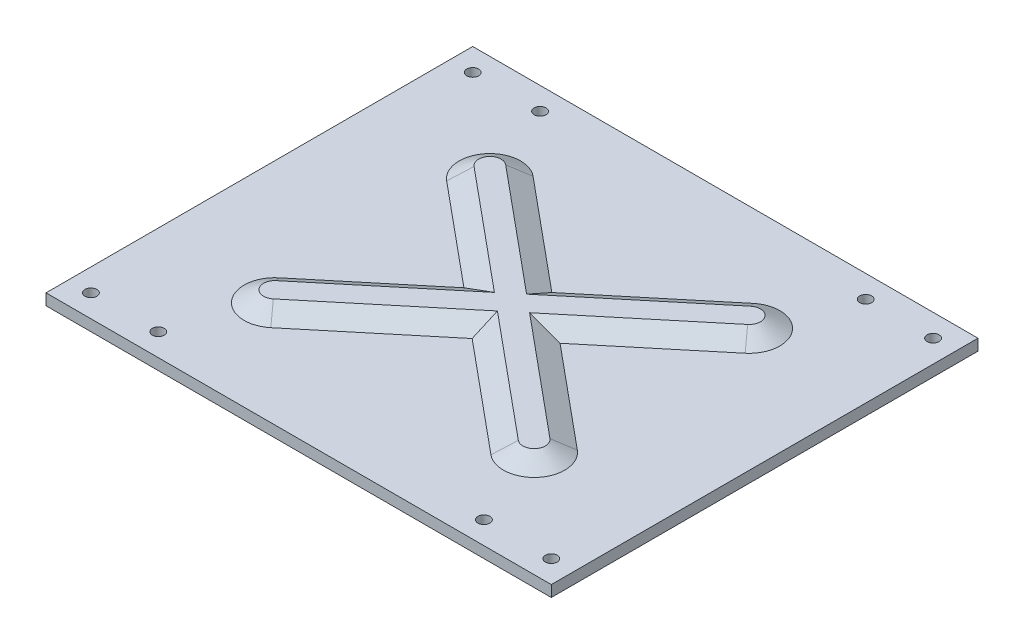
ISO-10303-21;
HEADER;
FILE_DESCRIPTION(('STEP AP214'),'2;1');
FILE_NAME('part.step','',(''),(''),'','','');
FILE_SCHEMA(('AUTOMOTIVE_DESIGN { 1 0 10303 214 1 1 1 1 }'));
ENDSEC;
DATA;
#1=APPLICATION_CONTEXT('core data for automotive mechanical design processes');
#2=APPLICATION_PROTOCOL_DEFINITION('international standard','automotive_design',2000,#1);
#3=PRODUCT_CONTEXT('',#1,'mechanical');
#4=PRODUCT('Part','Part','',(#3));
#5=PRODUCT_RELATED_PRODUCT_CATEGORY('part','',(#4));
#6=PRODUCT_DEFINITION_FORMATION('','',#4);
#7=PRODUCT_DEFINITION_CONTEXT('part definition',#1,'design');
#8=PRODUCT_DEFINITION('design','',#6,#7);
#9=PRODUCT_DEFINITION_SHAPE('','',#8);
#10=(LENGTH_UNIT() NAMED_UNIT(*) SI_UNIT(.MILLI.,.METRE.));
#11=(NAMED_UNIT(*) PLANE_ANGLE_UNIT() SI_UNIT($,.RADIAN.));
#12=(NAMED_UNIT(*) SI_UNIT($,.STERADIAN.) SOLID_ANGLE_UNIT());
#13=UNCERTAINTY_MEASURE_WITH_UNIT(LENGTH_MEASURE(1.E-05),#10,'distance_accuracy_value','');
#14=(GEOMETRIC_REPRESENTATION_CONTEXT(3) GLOBAL_UNCERTAINTY_ASSIGNED_CONTEXT((#13)) GLOBAL_UNIT_ASSIGNED_CONTEXT((#10,
#11,#12)) REPRESENTATION_CONTEXT('',''));
#15=CARTESIAN_POINT('',(0.,0.,0.));
#16=DIRECTION('',(0.,0.,1.));
#17=DIRECTION('',(1.,0.,0.));
#18=AXIS2_PLACEMENT_3D('',#15,#16,#17);
#19=CARTESIAN_POINT('',(0.,5.,0.));
#20=DIRECTION('',(0.,-1.,0.));
#21=DIRECTION('',(0.,0.,-1.));
#22=AXIS2_PLACEMENT_3D('',#19,#20,#21);
#23=PLANE('',#22);
#24=CARTESIAN_POINT('',(170.231847029505,5.,-47.1248097804108));
#25=DIRECTION('',(0.,-1.,0.));
#26=DIRECTION('',(0.,0.,-1.));
#27=AXIS2_PLACEMENT_3D('',#24,#25,#26);
#28=CIRCLE('',#27,13.6602540378445);
#29=CARTESIAN_POINT('',(178.951677169634,5.,-57.6398990670375));
#30=VERTEX_POINT('',#29);
#31=CARTESIAN_POINT('',(161.512016889375,5.,-36.6097204937839));
#32=VERTEX_POINT('',#31);
#33=EDGE_CURVE('E42',#30,#32,#28,.T.);
#34=ORIENTED_EDGE('',*,*,#33,.T.);
#35=DIRECTION('',(-0.769757960393397,0.,-0.638335869594524));
#36=VECTOR('',#35,1.);
#37=CARTESIAN_POINT('',(106.971849207843,5.,-81.8381522296885));
#38=LINE('',#37,#36);
#39=CARTESIAN_POINT('',(112.5,5.,-77.2538320605828));
#40=VERTEX_POINT('',#39);
#41=EDGE_CURVE('E11',#32,#40,#38,.T.);
#42=ORIENTED_EDGE('',*,*,#41,.T.);
#43=DIRECTION('',(-0.769757960393397,0.,0.638335869594524));
#44=VECTOR('',#43,1.);
#45=CARTESIAN_POINT('',(7.88091579398925,5.,9.50345728098704));
#46=LINE('',#45,#44);
#47=CARTESIAN_POINT('',(63.4879831106248,5.,-36.6097204937838));
#48=VERTEX_POINT('',#47);
#49=EDGE_CURVE('E275',#40,#48,#46,.T.);
#50=ORIENTED_EDGE('',*,*,#49,.T.);
#51=CARTESIAN_POINT('',(54.7681529704953,5.,-47.1248097804107));
#52=DIRECTION('',(0.,-1.,0.));
#53=DIRECTION('',(0.,0.,-1.));
#54=AXIS2_PLACEMENT_3D('',#51,#52,#53);
#55=CIRCLE('',#54,13.6602540378445);
#56=CARTESIAN_POINT('',(46.0483228303657,5.,-57.6398990670375));
#57=VERTEX_POINT('',#56);
#58=EDGE_CURVE('E162',#48,#57,#55,.T.);
#59=ORIENTED_EDGE('',*,*,#58,.T.);
#60=DIRECTION('',(0.769757960393397,0.,-0.638335869594524));
#61=VECTOR('',#60,1.);
#62=CARTESIAN_POINT('',(-9.55874448626985,5.,-11.5267212922666));
#63=LINE('',#62,#61);
#64=CARTESIAN_POINT('',(91.1002092495263,5.,-95.));
#65=VERTEX_POINT('',#64);
#66=EDGE_CURVE('E268',#57,#65,#63,.T.);
#67=ORIENTED_EDGE('',*,*,#66,.T.);
#68=DIRECTION('',(-0.769757960393397,0.,-0.638335869594524));
#69=VECTOR('',#68,1.);
#70=CARTESIAN_POINT('',(46.0483228303657,5.,-132.360100932962));
#71=LINE('',#70,#69);
#72=CARTESIAN_POINT('',(46.0483228303657,5.,-132.360100932962));
#73=VERTEX_POINT('',#72);
#74=EDGE_CURVE('E270',#65,#73,#71,.T.);
#75=ORIENTED_EDGE('',*,*,#74,.T.);
#76=CARTESIAN_POINT('',(54.7681529704953,5.,-142.875190219589));
#77=DIRECTION('',(0.,-1.,0.));
#78=DIRECTION('',(0.,0.,-1.));
#79=AXIS2_PLACEMENT_3D('',#76,#77,#78);
#80=CIRCLE('',#79,13.6602540378445);
#81=CARTESIAN_POINT('',(63.4879831106248,5.,-153.390279506216));
#82=VERTEX_POINT('',#81);
#83=EDGE_CURVE('E273',#73,#82,#80,.T.);
#84=ORIENTED_EDGE('',*,*,#83,.T.);
#85=DIRECTION('',(0.769757960393397,0.,0.638335869594524));
#86=VECTOR('',#85,1.);
#87=CARTESIAN_POINT('',(118.028150792157,5.,-108.161847770311));
#88=LINE('',#87,#86);
#89=CARTESIAN_POINT('',(112.5,5.,-112.746167939417));
#90=VERTEX_POINT('',#89);
#91=EDGE_CURVE('E277',#82,#90,#88,.T.);
#92=ORIENTED_EDGE('',*,*,#91,.T.);
#93=DIRECTION('',(0.769757960393397,0.,-0.638335869594524));
#94=VECTOR('',#93,1.);
#95=CARTESIAN_POINT('',(-9.55874448626981,5.,-11.5267212922665));
#96=LINE('',#95,#94);
#97=CARTESIAN_POINT('',(161.512016889375,5.,-153.390279506216));
#98=VERTEX_POINT('',#97);
#99=EDGE_CURVE('E279',#90,#98,#96,.T.);
#100=ORIENTED_EDGE('',*,*,#99,.T.);
#101=CARTESIAN_POINT('',(170.231847029505,5.,-142.875190219589));
#102=DIRECTION('',(0.,-1.,0.));
#103=DIRECTION('',(0.,0.,-1.));
#104=AXIS2_PLACEMENT_3D('',#101,#102,#103);
#105=CIRCLE('',#104,13.6602540378444);
#106=CARTESIAN_POINT('',(178.951677169634,5.,-132.360100932962));
#107=VERTEX_POINT('',#106);
#108=EDGE_CURVE('E281',#98,#107,#105,.T.);
#109=ORIENTED_EDGE('',*,*,#108,.T.);
#110=DIRECTION('',(-0.769757960393397,0.,0.638335869594524));
#111=VECTOR('',#110,1.);
#112=CARTESIAN_POINT('',(7.88091579398922,5.,9.503457280987));
#113=LINE('',#112,#111);
#114=CARTESIAN_POINT('',(133.899790750474,5.,-95.));
#115=VERTEX_POINT('',#114);
#116=EDGE_CURVE('E283',#107,#115,#113,.T.);
#117=ORIENTED_EDGE('',*,*,#116,.T.);
#118=DIRECTION('',(0.769757960393397,0.,0.638335869594524));
#119=VECTOR('',#118,1.);
#120=CARTESIAN_POINT('',(178.951677169634,5.,-57.6398990670376));
#121=LINE('',#120,#119);
#122=EDGE_CURVE('E53',#115,#30,#121,.T.);
#123=ORIENTED_EDGE('',*,*,#122,.T.);
#124=EDGE_LOOP('',(#34,#42,#50,#59,#67,#75,#84,#92,#100,#109,#117,#123));
#125=FACE_BOUND('',#124,.T.);
#126=CARTESIAN_POINT('',(10.,5.,-10.));
#127=DIRECTION('',(0.,1.,0.));
#128=DIRECTION('',(0.,0.,-1.));
#129=AXIS2_PLACEMENT_3D('',#126,#127,#128);
#130=CIRCLE('',#129,2.65);
#131=CARTESIAN_POINT('',(10.,5.,-12.65));
#132=VERTEX_POINT('',#131);
#133=EDGE_CURVE('E191',#132,#132,#130,.T.);
#134=ORIENTED_EDGE('',*,*,#133,.F.);
#135=EDGE_LOOP('',(#134));
#136=FACE_BOUND('',#135,.T.);
#137=CARTESIAN_POINT('',(40.,5.,-10.));
#138=DIRECTION('',(0.,1.,0.));
#139=DIRECTION('',(0.,0.,-1.));
#140=AXIS2_PLACEMENT_3D('',#137,#138,#139);
#141=CIRCLE('',#140,2.65);
#142=CARTESIAN_POINT('',(40.,5.,-12.65));
#143=VERTEX_POINT('',#142);
#144=EDGE_CURVE('E197',#143,#143,#141,.T.);
#145=ORIENTED_EDGE('',*,*,#144,.F.);
#146=EDGE_LOOP('',(#145));
#147=FACE_BOUND('',#146,.T.);
#148=CARTESIAN_POINT('',(185.,5.,-10.));
#149=DIRECTION('',(0.,1.,0.));
#150=DIRECTION('',(0.,0.,-1.));
#151=AXIS2_PLACEMENT_3D('',#148,#149,#150);
#152=CIRCLE('',#151,2.65000000000001);
#153=CARTESIAN_POINT('',(185.,5.,-12.65));
#154=VERTEX_POINT('',#153);
#155=EDGE_CURVE('E203',#154,#154,#152,.T.);
#156=ORIENTED_EDGE('',*,*,#155,.F.);
#157=EDGE_LOOP('',(#156));
#158=FACE_BOUND('',#157,.T.);
#159=CARTESIAN_POINT('',(215.,5.,-10.));
#160=DIRECTION('',(0.,1.,0.));
#161=DIRECTION('',(0.,0.,-1.));
#162=AXIS2_PLACEMENT_3D('',#159,#160,#161);
#163=CIRCLE('',#162,2.65000000000001);
#164=CARTESIAN_POINT('',(215.,5.,-12.65));
#165=VERTEX_POINT('',#164);
#166=EDGE_CURVE('E209',#165,#165,#163,.T.);
#167=ORIENTED_EDGE('',*,*,#166,.F.);
#168=EDGE_LOOP('',(#167));
#169=FACE_BOUND('',#168,.T.);
#170=CARTESIAN_POINT('',(215.,5.,-180.));
#171=DIRECTION('',(0.,1.,0.));
#172=DIRECTION('',(0.,0.,1.));
#173=AXIS2_PLACEMENT_3D('',#170,#171,#172);
#174=CIRCLE('',#173,2.65000000000002);
#175=CARTESIAN_POINT('',(215.,5.,-177.35));
#176=VERTEX_POINT('',#175);
#177=EDGE_CURVE('E215',#176,#176,#174,.T.);
#178=ORIENTED_EDGE('',*,*,#177,.F.);
#179=EDGE_LOOP('',(#178));
#180=FACE_BOUND('',#179,.T.);
#181=CARTESIAN_POINT('',(185.,5.,-180.));
#182=DIRECTION('',(0.,1.,0.));
#183=DIRECTION('',(0.,0.,1.));
#184=AXIS2_PLACEMENT_3D('',#181,#182,#183);
#185=CIRCLE('',#184,2.65000000000002);
#186=CARTESIAN_POINT('',(185.,5.,-177.35));
#187=VERTEX_POINT('',#186);
#188=EDGE_CURVE('E221',#187,#187,#185,.T.);
#189=ORIENTED_EDGE('',*,*,#188,.F.);
#190=EDGE_LOOP('',(#189));
#191=FACE_BOUND('',#190,.T.);
#192=CARTESIAN_POINT('',(40.,5.,-180.));
#193=DIRECTION('',(0.,1.,0.));
#194=DIRECTION('',(0.,0.,1.));
#195=AXIS2_PLACEMENT_3D('',#192,#193,#194);
#196=CIRCLE('',#195,2.65);
#197=CARTESIAN_POINT('',(40.,5.,-177.35));
#198=VERTEX_POINT('',#197);
#199=EDGE_CURVE('E227',#198,#198,#196,.T.);
#200=ORIENTED_EDGE('',*,*,#199,.F.);
#201=EDGE_LOOP('',(#200));
#202=FACE_BOUND('',#201,.T.);
#203=CARTESIAN_POINT('',(10.,5.,-180.));
#204=DIRECTION('',(0.,1.,0.));
#205=DIRECTION('',(0.,0.,1.));
#206=AXIS2_PLACEMENT_3D('',#203,#204,#205);
#207=CIRCLE('',#206,2.65);
#208=CARTESIAN_POINT('',(10.,5.,-177.35));
#209=VERTEX_POINT('',#208);
#210=EDGE_CURVE('E233',#209,#209,#207,.T.);
#211=ORIENTED_EDGE('',*,*,#210,.F.);
#212=EDGE_LOOP('',(#211));
#213=FACE_BOUND('',#212,.T.);
#214=DIRECTION('',(0.,0.,1.));
#215=VECTOR('',#214,1.);
#216=CARTESIAN_POINT('',(0.,5.,0.));
#217=LINE('',#216,#215);
#218=CARTESIAN_POINT('',(0.,5.,-190.));
#219=VERTEX_POINT('',#218);
#220=CARTESIAN_POINT('',(0.,5.,0.));
#221=VERTEX_POINT('',#220);
#222=EDGE_CURVE('E239',#219,#221,#217,.T.);
#223=ORIENTED_EDGE('',*,*,#222,.T.);
#224=DIRECTION('',(1.,0.,0.));
#225=VECTOR('',#224,1.);
#226=CARTESIAN_POINT('',(0.,5.,0.));
#227=LINE('',#226,#225);
#228=CARTESIAN_POINT('',(225.,5.,0.));
#229=VERTEX_POINT('',#228);
#230=EDGE_CURVE('E242',#221,#229,#227,.T.);
#231=ORIENTED_EDGE('',*,*,#230,.T.);
#232=DIRECTION('',(0.,0.,-1.));
#233=VECTOR('',#232,1.);
#234=CARTESIAN_POINT('',(225.,5.,0.));
#235=LINE('',#234,#233);
#236=CARTESIAN_POINT('',(225.,5.,-190.));
#237=VERTEX_POINT('',#236);
#238=EDGE_CURVE('E245',#229,#237,#235,.T.);
#239=ORIENTED_EDGE('',*,*,#238,.T.);
#240=DIRECTION('',(-1.,0.,0.));
#241=VECTOR('',#240,1.);
#242=CARTESIAN_POINT('',(0.,5.,-190.));
#243=LINE('',#242,#241);
#244=EDGE_CURVE('E247',#237,#219,#243,.T.);
#245=ORIENTED_EDGE('',*,*,#244,.T.);
#246=EDGE_LOOP('',(#223,#231,#239,#245));
#247=FACE_BOUND('',#246,.T.);
#248=ADVANCED_FACE('F33',(#125,#136,#147,#158,#169,#180,#191,#202,#213,#247),#23,.F.);
#249=CARTESIAN_POINT('',(0.,0.,0.));
#250=DIRECTION('',(0.,-1.,0.));
#251=DIRECTION('',(0.,0.,-1.));
#252=AXIS2_PLACEMENT_3D('',#249,#250,#251);
#253=PLANE('',#252);
#254=CARTESIAN_POINT('',(40.,0.,-10.));
#255=DIRECTION('',(0.,1.,0.));
#256=DIRECTION('',(0.,0.,-1.));
#257=AXIS2_PLACEMENT_3D('',#254,#255,#256);
#258=CIRCLE('',#257,2.65);
#259=CARTESIAN_POINT('',(40.,0.,-12.65));
#260=VERTEX_POINT('',#259);
#261=EDGE_CURVE('E194',#260,#260,#258,.T.);
#262=ORIENTED_EDGE('',*,*,#261,.T.);
#263=EDGE_LOOP('',(#262));
#264=FACE_BOUND('',#263,.T.);
#265=CARTESIAN_POINT('',(215.,0.,-10.));
#266=DIRECTION('',(0.,1.,0.));
#267=DIRECTION('',(0.,0.,-1.));
#268=AXIS2_PLACEMENT_3D('',#265,#266,#267);
#269=CIRCLE('',#268,2.65000000000001);
#270=CARTESIAN_POINT('',(215.,0.,-12.65));
#271=VERTEX_POINT('',#270);
#272=EDGE_CURVE('E206',#271,#271,#269,.T.);
#273=ORIENTED_EDGE('',*,*,#272,.T.);
#274=EDGE_LOOP('',(#273));
#275=FACE_BOUND('',#274,.T.);
#276=CARTESIAN_POINT('',(185.,0.,-180.));
#277=DIRECTION('',(0.,1.,0.));
#278=DIRECTION('',(0.,0.,1.));
#279=AXIS2_PLACEMENT_3D('',#276,#277,#278);
#280=CIRCLE('',#279,2.65000000000002);
#281=CARTESIAN_POINT('',(185.,0.,-177.35));
#282=VERTEX_POINT('',#281);
#283=EDGE_CURVE('E218',#282,#282,#280,.T.);
#284=ORIENTED_EDGE('',*,*,#283,.T.);
#285=EDGE_LOOP('',(#284));
#286=FACE_BOUND('',#285,.T.);
#287=CARTESIAN_POINT('',(10.,0.,-180.));
#288=DIRECTION('',(0.,1.,0.));
#289=DIRECTION('',(0.,0.,1.));
#290=AXIS2_PLACEMENT_3D('',#287,#288,#289);
#291=CIRCLE('',#290,2.65);
#292=CARTESIAN_POINT('',(10.,0.,-177.35));
#293=VERTEX_POINT('',#292);
#294=EDGE_CURVE('E230',#293,#293,#291,.T.);
#295=ORIENTED_EDGE('',*,*,#294,.T.);
#296=EDGE_LOOP('',(#295));
#297=FACE_BOUND('',#296,.T.);
#298=DIRECTION('',(0.,0.,1.));
#299=VECTOR('',#298,1.);
#300=CARTESIAN_POINT('',(0.,0.,0.));
#301=LINE('',#300,#299);
#302=CARTESIAN_POINT('',(0.,0.,-190.));
#303=VERTEX_POINT('',#302);
#304=CARTESIAN_POINT('',(0.,0.,0.));
#305=VERTEX_POINT('',#304);
#306=EDGE_CURVE('E236',#303,#305,#301,.T.);
#307=ORIENTED_EDGE('',*,*,#306,.F.);
#308=DIRECTION('',(-1.,0.,0.));
#309=VECTOR('',#308,1.);
#310=CARTESIAN_POINT('',(0.,0.,-190.));
#311=LINE('',#310,#309);
#312=CARTESIAN_POINT('',(225.,0.,-190.));
#313=VERTEX_POINT('',#312);
#314=EDGE_CURVE('E243',#313,#303,#311,.T.);
#315=ORIENTED_EDGE('',*,*,#314,.F.);
#316=DIRECTION('',(0.,0.,-1.));
#317=VECTOR('',#316,1.);
#318=CARTESIAN_POINT('',(225.,0.,0.));
#319=LINE('',#318,#317);
#320=CARTESIAN_POINT('',(225.,0.,0.));
#321=VERTEX_POINT('',#320);
#322=EDGE_CURVE('E254',#321,#313,#319,.T.);
#323=ORIENTED_EDGE('',*,*,#322,.F.);
#324=DIRECTION('',(1.,0.,0.));
#325=VECTOR('',#324,1.);
#326=CARTESIAN_POINT('',(0.,0.,0.));
#327=LINE('',#326,#325);
#328=EDGE_CURVE('E252',#305,#321,#327,.T.);
#329=ORIENTED_EDGE('',*,*,#328,.F.);
#330=EDGE_LOOP('',(#307,#315,#323,#329));
#331=FACE_BOUND('',#330,.T.);
#332=CARTESIAN_POINT('',(40.,0.,-180.));
#333=DIRECTION('',(0.,1.,0.));
#334=DIRECTION('',(0.,0.,1.));
#335=AXIS2_PLACEMENT_3D('',#332,#333,#334);
#336=CIRCLE('',#335,2.65);
#337=CARTESIAN_POINT('',(40.,0.,-177.35));
#338=VERTEX_POINT('',#337);
#339=EDGE_CURVE('E224',#338,#338,#336,.T.);
#340=ORIENTED_EDGE('',*,*,#339,.T.);
#341=EDGE_LOOP('',(#340));
#342=FACE_BOUND('',#341,.T.);
#343=CARTESIAN_POINT('',(215.,0.,-180.));
#344=DIRECTION('',(0.,1.,0.));
#345=DIRECTION('',(0.,0.,1.));
#346=AXIS2_PLACEMENT_3D('',#343,#344,#345);
#347=CIRCLE('',#346,2.65000000000002);
#348=CARTESIAN_POINT('',(215.,0.,-177.35));
#349=VERTEX_POINT('',#348);
#350=EDGE_CURVE('E212',#349,#349,#347,.T.);
#351=ORIENTED_EDGE('',*,*,#350,.T.);
#352=EDGE_LOOP('',(#351));
#353=FACE_BOUND('',#352,.T.);
#354=CARTESIAN_POINT('',(185.,0.,-10.));
#355=DIRECTION('',(0.,1.,0.));
#356=DIRECTION('',(0.,0.,-1.));
#357=AXIS2_PLACEMENT_3D('',#354,#355,#356);
#358=CIRCLE('',#357,2.65000000000001);
#359=CARTESIAN_POINT('',(185.,0.,-12.65));
#360=VERTEX_POINT('',#359);
#361=EDGE_CURVE('E200',#360,#360,#358,.T.);
#362=ORIENTED_EDGE('',*,*,#361,.T.);
#363=EDGE_LOOP('',(#362));
#364=FACE_BOUND('',#363,.T.);
#365=CARTESIAN_POINT('',(10.,0.,-10.));
#366=DIRECTION('',(0.,1.,0.));
#367=DIRECTION('',(0.,0.,-1.));
#368=AXIS2_PLACEMENT_3D('',#365,#366,#367);
#369=CIRCLE('',#368,2.65);
#370=CARTESIAN_POINT('',(10.,0.,-12.65));
#371=VERTEX_POINT('',#370);
#372=EDGE_CURVE('E190',#371,#371,#369,.T.);
#373=ORIENTED_EDGE('',*,*,#372,.T.);
#374=EDGE_LOOP('',(#373));
#375=FACE_BOUND('',#374,.T.);
#376=ADVANCED_FACE('F346',(#264,#275,#286,#297,#331,#342,#353,#364,#375),#253,.T.);
#377=CARTESIAN_POINT('',(0.,5.,0.));
#378=DIRECTION('',(1.,0.,0.));
#379=DIRECTION('',(0.,0.,-1.));
#380=AXIS2_PLACEMENT_3D('',#377,#378,#379);
#381=PLANE('',#380);
#382=ORIENTED_EDGE('',*,*,#306,.T.);
#383=DIRECTION('',(0.,-1.,0.));
#384=VECTOR('',#383,1.);
#385=CARTESIAN_POINT('',(0.,5.,0.));
#386=LINE('',#385,#384);
#387=EDGE_CURVE('E265',#221,#305,#386,.T.);
#388=ORIENTED_EDGE('',*,*,#387,.F.);
#389=ORIENTED_EDGE('',*,*,#222,.F.);
#390=DIRECTION('',(0.,-1.,0.));
#391=VECTOR('',#390,1.);
#392=CARTESIAN_POINT('',(0.,5.,-190.));
#393=LINE('',#392,#391);
#394=EDGE_CURVE('E249',#219,#303,#393,.T.);
#395=ORIENTED_EDGE('',*,*,#394,.T.);
#396=EDGE_LOOP('',(#382,#388,#389,#395));
#397=FACE_BOUND('',#396,.T.);
#398=ADVANCED_FACE('F351',(#397),#381,.F.);
#399=CARTESIAN_POINT('',(0.,5.,0.));
#400=DIRECTION('',(0.,0.,-1.));
#401=DIRECTION('',(-1.,0.,0.));
#402=AXIS2_PLACEMENT_3D('',#399,#400,#401);
#403=PLANE('',#402);
#404=ORIENTED_EDGE('',*,*,#328,.T.);
#405=DIRECTION('',(0.,-1.,0.));
#406=VECTOR('',#405,1.);
#407=CARTESIAN_POINT('',(225.,5.,0.));
#408=LINE('',#407,#406);
#409=EDGE_CURVE('E262',#229,#321,#408,.T.);
#410=ORIENTED_EDGE('',*,*,#409,.F.);
#411=ORIENTED_EDGE('',*,*,#230,.F.);
#412=ORIENTED_EDGE('',*,*,#387,.T.);
#413=EDGE_LOOP('',(#404,#410,#411,#412));
#414=FACE_BOUND('',#413,.T.);
#415=ADVANCED_FACE('F365',(#414),#403,.F.);
#416=CARTESIAN_POINT('',(225.,5.,0.));
#417=DIRECTION('',(-1.,0.,0.));
#418=DIRECTION('',(0.,0.,1.));
#419=AXIS2_PLACEMENT_3D('',#416,#417,#418);
#420=PLANE('',#419);
#421=ORIENTED_EDGE('',*,*,#322,.T.);
#422=DIRECTION('',(0.,-1.,0.));
#423=VECTOR('',#422,1.);
#424=CARTESIAN_POINT('',(225.,5.,-190.));
#425=LINE('',#424,#423);
#426=EDGE_CURVE('E259',#237,#313,#425,.T.);
#427=ORIENTED_EDGE('',*,*,#426,.F.);
#428=ORIENTED_EDGE('',*,*,#238,.F.);
#429=ORIENTED_EDGE('',*,*,#409,.T.);
#430=EDGE_LOOP('',(#421,#427,#428,#429));
#431=FACE_BOUND('',#430,.T.);
#432=ADVANCED_FACE('F361',(#431),#420,.F.);
#433=CARTESIAN_POINT('',(0.,5.,-190.));
#434=DIRECTION('',(0.,0.,1.));
#435=DIRECTION('',(1.,0.,0.));
#436=AXIS2_PLACEMENT_3D('',#433,#434,#435);
#437=PLANE('',#436);
#438=ORIENTED_EDGE('',*,*,#314,.T.);
#439=ORIENTED_EDGE('',*,*,#394,.F.);
#440=ORIENTED_EDGE('',*,*,#244,.F.);
#441=ORIENTED_EDGE('',*,*,#426,.T.);
#442=EDGE_LOOP('',(#438,#439,#440,#441));
#443=FACE_BOUND('',#442,.T.);
#444=ADVANCED_FACE('F358',(#443),#437,.F.);
#445=CARTESIAN_POINT('',(10.,5.,-180.));
#446=DIRECTION('',(0.,-1.,0.));
#447=DIRECTION('',(0.,0.,-1.));
#448=AXIS2_PLACEMENT_3D('',#445,#446,#447);
#449=CYLINDRICAL_SURFACE('',#448,2.65);
#450=ORIENTED_EDGE('',*,*,#210,.T.);
#451=EDGE_LOOP('',(#450));
#452=FACE_BOUND('',#451,.T.);
#453=ORIENTED_EDGE('',*,*,#294,.F.);
#454=EDGE_LOOP('',(#453));
#455=FACE_BOUND('',#454,.T.);
#456=ADVANCED_FACE('F355',(#452,#455),#449,.F.);
#457=CARTESIAN_POINT('',(40.,5.,-180.));
#458=DIRECTION('',(0.,-1.,0.));
#459=DIRECTION('',(0.,0.,-1.));
#460=AXIS2_PLACEMENT_3D('',#457,#458,#459);
#461=CYLINDRICAL_SURFACE('',#460,2.65);
#462=ORIENTED_EDGE('',*,*,#199,.T.);
#463=EDGE_LOOP('',(#462));
#464=FACE_BOUND('',#463,.T.);
#465=ORIENTED_EDGE('',*,*,#339,.F.);
#466=EDGE_LOOP('',(#465));
#467=FACE_BOUND('',#466,.T.);
#468=ADVANCED_FACE('F531',(#464,#467),#461,.F.);
#469=CARTESIAN_POINT('',(185.,5.,-180.));
#470=DIRECTION('',(0.,-1.,0.));
#471=DIRECTION('',(0.,0.,-1.));
#472=AXIS2_PLACEMENT_3D('',#469,#470,#471);
#473=CYLINDRICAL_SURFACE('',#472,2.65000000000002);
#474=ORIENTED_EDGE('',*,*,#188,.T.);
#475=EDGE_LOOP('',(#474));
#476=FACE_BOUND('',#475,.T.);
#477=ORIENTED_EDGE('',*,*,#283,.F.);
#478=EDGE_LOOP('',(#477));
#479=FACE_BOUND('',#478,.T.);
#480=ADVANCED_FACE('F521',(#476,#479),#473,.F.);
#481=CARTESIAN_POINT('',(215.,5.,-180.));
#482=DIRECTION('',(0.,-1.,0.));
#483=DIRECTION('',(0.,0.,-1.));
#484=AXIS2_PLACEMENT_3D('',#481,#482,#483);
#485=CYLINDRICAL_SURFACE('',#484,2.65000000000002);
#486=ORIENTED_EDGE('',*,*,#177,.T.);
#487=EDGE_LOOP('',(#486));
#488=FACE_BOUND('',#487,.T.);
#489=ORIENTED_EDGE('',*,*,#350,.F.);
#490=EDGE_LOOP('',(#489));
#491=FACE_BOUND('',#490,.T.);
#492=ADVANCED_FACE('F511',(#488,#491),#485,.F.);
#493=CARTESIAN_POINT('',(215.,5.,-10.));
#494=DIRECTION('',(0.,-1.,0.));
#495=DIRECTION('',(0.,0.,-1.));
#496=AXIS2_PLACEMENT_3D('',#493,#494,#495);
#497=CYLINDRICAL_SURFACE('',#496,2.65000000000001);
#498=ORIENTED_EDGE('',*,*,#166,.T.);
#499=EDGE_LOOP('',(#498));
#500=FACE_BOUND('',#499,.T.);
#501=ORIENTED_EDGE('',*,*,#272,.F.);
#502=EDGE_LOOP('',(#501));
#503=FACE_BOUND('',#502,.T.);
#504=ADVANCED_FACE('F501',(#500,#503),#497,.F.);
#505=CARTESIAN_POINT('',(185.,5.,-10.));
#506=DIRECTION('',(0.,-1.,0.));
#507=DIRECTION('',(0.,0.,-1.));
#508=AXIS2_PLACEMENT_3D('',#505,#506,#507);
#509=CYLINDRICAL_SURFACE('',#508,2.65000000000001);
#510=ORIENTED_EDGE('',*,*,#155,.T.);
#511=EDGE_LOOP('',(#510));
#512=FACE_BOUND('',#511,.T.);
#513=ORIENTED_EDGE('',*,*,#361,.F.);
#514=EDGE_LOOP('',(#513));
#515=FACE_BOUND('',#514,.T.);
#516=ADVANCED_FACE('F491',(#512,#515),#509,.F.);
#517=CARTESIAN_POINT('',(40.,5.,-10.));
#518=DIRECTION('',(0.,-1.,0.));
#519=DIRECTION('',(0.,0.,-1.));
#520=AXIS2_PLACEMENT_3D('',#517,#518,#519);
#521=CYLINDRICAL_SURFACE('',#520,2.65);
#522=ORIENTED_EDGE('',*,*,#144,.T.);
#523=EDGE_LOOP('',(#522));
#524=FACE_BOUND('',#523,.T.);
#525=ORIENTED_EDGE('',*,*,#261,.F.);
#526=EDGE_LOOP('',(#525));
#527=FACE_BOUND('',#526,.T.);
#528=ADVANCED_FACE('F481',(#524,#527),#521,.F.);
#529=CARTESIAN_POINT('',(10.,5.,-10.));
#530=DIRECTION('',(0.,-1.,0.));
#531=DIRECTION('',(0.,0.,-1.));
#532=AXIS2_PLACEMENT_3D('',#529,#530,#531);
#533=CYLINDRICAL_SURFACE('',#532,2.65);
#534=ORIENTED_EDGE('',*,*,#133,.T.);
#535=EDGE_LOOP('',(#534));
#536=FACE_BOUND('',#535,.T.);
#537=ORIENTED_EDGE('',*,*,#372,.F.);
#538=EDGE_LOOP('',(#537));
#539=FACE_BOUND('',#538,.T.);
#540=ADVANCED_FACE('F466',(#536,#539),#533,.F.);
#541=CARTESIAN_POINT('',(54.7681529704953,10.,-142.875190219589));
#542=DIRECTION('',(0.,-1.,0.));
#543=DIRECTION('',(0.,0.,-1.));
#544=AXIS2_PLACEMENT_3D('',#541,#542,#543);
#545=PLANE('',#544);
#546=DIRECTION('',(0.769757960393397,0.,0.638335869594524));
#547=VECTOR('',#546,1.);
#548=CARTESIAN_POINT('',(51.5764736225226,10.,-139.026400417622));
#549=LINE('',#548,#547);
#550=CARTESIAN_POINT('',(51.5764736225226,10.,-139.026400417622));
#551=VERTEX_POINT('',#550);
#552=CARTESIAN_POINT('',(104.667132949655,10.,-95.));
#553=VERTEX_POINT('',#552);
#554=EDGE_CURVE('E183',#551,#553,#549,.T.);
#555=ORIENTED_EDGE('',*,*,#554,.T.);
#556=DIRECTION('',(0.769757960393397,0.,-0.638335869594524));
#557=VECTOR('',#556,1.);
#558=CARTESIAN_POINT('',(51.5764736225226,10.,-50.9735995823777));
#559=LINE('',#558,#557);
#560=CARTESIAN_POINT('',(51.5764736225226,10.,-50.9735995823777));
#561=VERTEX_POINT('',#560);
#562=EDGE_CURVE('E153',#561,#553,#559,.T.);
#563=ORIENTED_EDGE('',*,*,#562,.F.);
#564=CARTESIAN_POINT('',(54.7681529704953,10.,-47.1248097804107));
#565=DIRECTION('',(0.,-1.,0.));
#566=DIRECTION('',(0.,0.,1.));
#567=AXIS2_PLACEMENT_3D('',#564,#565,#566);
#568=CIRCLE('',#567,5.);
#569=CARTESIAN_POINT('',(57.9598323184679,10.,-43.2760199784437));
#570=VERTEX_POINT('',#569);
#571=EDGE_CURVE('E145',#570,#561,#568,.T.);
#572=ORIENTED_EDGE('',*,*,#571,.F.);
#573=DIRECTION('',(-0.769757960393397,0.,0.638335869594524));
#574=VECTOR('',#573,1.);
#575=CARTESIAN_POINT('',(57.9598323184679,10.,-43.2760199784437));
#576=LINE('',#575,#574);
#577=CARTESIAN_POINT('',(112.5,10.,-88.5044517143484));
#578=VERTEX_POINT('',#577);
#579=EDGE_CURVE('E150',#578,#570,#576,.T.);
#580=ORIENTED_EDGE('',*,*,#579,.F.);
#581=CARTESIAN_POINT('',(167.040167681532,10.,-43.2760199784437));
#582=VERTEX_POINT('',#581);
#583=EDGE_CURVE('E182',#578,#582,#549,.T.);
#584=ORIENTED_EDGE('',*,*,#583,.T.);
#585=CARTESIAN_POINT('',(170.231847029505,10.,-47.1248097804108));
#586=DIRECTION('',(0.,1.,0.));
#587=DIRECTION('',(0.,0.,1.));
#588=AXIS2_PLACEMENT_3D('',#585,#586,#587);
#589=CIRCLE('',#588,5.);
#590=CARTESIAN_POINT('',(173.423526377477,10.,-50.9735995823777));
#591=VERTEX_POINT('',#590);
#592=EDGE_CURVE('E185',#582,#591,#589,.T.);
#593=ORIENTED_EDGE('',*,*,#592,.T.);
#594=DIRECTION('',(-0.769757960393397,0.,-0.638335869594524));
#595=VECTOR('',#594,1.);
#596=CARTESIAN_POINT('',(57.9598323184679,10.,-146.723980021556));
#597=LINE('',#596,#595);
#598=CARTESIAN_POINT('',(120.332867050345,10.,-95.));
#599=VERTEX_POINT('',#598);
#600=EDGE_CURVE('E188',#591,#599,#597,.T.);
#601=ORIENTED_EDGE('',*,*,#600,.T.);
#602=CARTESIAN_POINT('',(173.423526377477,10.,-139.026400417622));
#603=VERTEX_POINT('',#602);
#604=EDGE_CURVE('E171',#603,#599,#576,.T.);
#605=ORIENTED_EDGE('',*,*,#604,.F.);
#606=CARTESIAN_POINT('',(170.231847029505,10.,-142.875190219589));
#607=DIRECTION('',(0.,-1.,0.));
#608=DIRECTION('',(0.,0.,-1.));
#609=AXIS2_PLACEMENT_3D('',#606,#607,#608);
#610=CIRCLE('',#609,5.);
#611=CARTESIAN_POINT('',(167.040167681532,10.,-146.723980021556));
#612=VERTEX_POINT('',#611);
#613=EDGE_CURVE('E174',#612,#603,#610,.T.);
#614=ORIENTED_EDGE('',*,*,#613,.F.);
#615=CARTESIAN_POINT('',(112.5,10.,-101.495548285652));
#616=VERTEX_POINT('',#615);
#617=EDGE_CURVE('E178',#616,#612,#559,.T.);
#618=ORIENTED_EDGE('',*,*,#617,.F.);
#619=CARTESIAN_POINT('',(57.9598323184679,10.,-146.723980021556));
#620=VERTEX_POINT('',#619);
#621=EDGE_CURVE('E187',#616,#620,#597,.T.);
#622=ORIENTED_EDGE('',*,*,#621,.T.);
#623=CARTESIAN_POINT('',(54.7681529704953,10.,-142.875190219589));
#624=DIRECTION('',(0.,1.,0.));
#625=DIRECTION('',(0.,0.,-1.));
#626=AXIS2_PLACEMENT_3D('',#623,#624,#625);
#627=CIRCLE('',#626,5.);
#628=EDGE_CURVE('E180',#620,#551,#627,.T.);
#629=ORIENTED_EDGE('',*,*,#628,.T.);
#630=EDGE_LOOP('',(#555,#563,#572,#580,#584,#593,#601,#605,#614,#618,#622,#629));
#631=FACE_BOUND('',#630,.T.);
#632=ADVANCED_FACE('F147',(#631),#545,.F.);
#633=CARTESIAN_POINT('',(57.9598323184679,10.,-146.723980021556));
#634=DIRECTION('',(0.31916793479726,0.86602540378444,-0.384878980196696));
#635=DIRECTION('',(0.769757960393397,0.,0.638335869594524));
#636=AXIS2_PLACEMENT_3D('',#633,#634,#635);
#637=PLANE('',#636);
#638=DIRECTION('',(0.,0.406119786522041,0.913819850405588));
#639=VECTOR('',#638,1.);
#640=CARTESIAN_POINT('',(112.5,42.5645936896751,-28.2211767292619));
#641=LINE('',#640,#639);
#642=EDGE_CURVE('E307',#90,#616,#641,.T.);
#643=ORIENTED_EDGE('',*,*,#642,.F.);
#644=ORIENTED_EDGE('',*,*,#91,.F.);
#645=DIRECTION('',(0.55281507921569,-0.499999999999997,-0.666629948465979));
#646=VECTOR('',#645,1.);
#647=CARTESIAN_POINT('',(57.9598323184679,10.,-146.723980021556));
#648=LINE('',#647,#646);
#649=EDGE_CURVE('E37',#620,#82,#648,.T.);
#650=ORIENTED_EDGE('',*,*,#649,.F.);
#651=ORIENTED_EDGE('',*,*,#621,.F.);
#652=EDGE_LOOP('',(#643,#644,#650,#651));
#653=FACE_BOUND('',#652,.T.);
#654=ADVANCED_FACE('F35',(#653),#637,.T.);
#655=CARTESIAN_POINT('',(54.7681529704953,9.99999999999998,-142.875190219589));
#656=DIRECTION('',(0.,-1.,0.));
#657=DIRECTION('',(0.,0.,-1.));
#658=AXIS2_PLACEMENT_3D('',#655,#656,#657);
#659=CONICAL_SURFACE('',#658,5.,1.0471975511966);
#660=ORIENTED_EDGE('',*,*,#649,.T.);
#661=ORIENTED_EDGE('',*,*,#83,.F.);
#662=DIRECTION('',(-0.552815079215691,-0.499999999999995,0.666629948465979));
#663=VECTOR('',#662,1.);
#664=CARTESIAN_POINT('',(51.5764736225227,9.99999999999998,-139.026400417622));
#665=LINE('',#664,#663);
#666=EDGE_CURVE('E305',#551,#73,#665,.T.);
#667=ORIENTED_EDGE('',*,*,#666,.F.);
#668=ORIENTED_EDGE('',*,*,#628,.F.);
#669=EDGE_LOOP('',(#660,#661,#667,#668));
#670=FACE_BOUND('',#669,.T.);
#671=ADVANCED_FACE('F318',(#670),#659,.T.);
#672=CARTESIAN_POINT('',(-9.55874448626982,5.,-11.5267212922665));
#673=DIRECTION('',(0.319167934797261,-0.86602540378444,0.384878980196697));
#674=DIRECTION('',(0.769757960393397,0.,-0.638335869594524));
#675=AXIS2_PLACEMENT_3D('',#672,#673,#674);
#676=PLANE('',#675);
#677=ORIENTED_EDGE('',*,*,#642,.T.);
#678=ORIENTED_EDGE('',*,*,#617,.T.);
#679=DIRECTION('',(0.552815079215684,0.499999999999999,0.666629948465982));
#680=VECTOR('',#679,1.);
#681=CARTESIAN_POINT('',(161.512016889375,5.,-153.390279506216));
#682=LINE('',#681,#680);
#683=EDGE_CURVE('E302',#98,#612,#682,.T.);
#684=ORIENTED_EDGE('',*,*,#683,.F.);
#685=ORIENTED_EDGE('',*,*,#99,.F.);
#686=EDGE_LOOP('',(#677,#678,#684,#685));
#687=FACE_BOUND('',#686,.T.);
#688=ADVANCED_FACE('F439',(#687),#676,.F.);
#689=CARTESIAN_POINT('',(51.5764736225226,10.,-139.026400417622));
#690=DIRECTION('',(-0.319167934797261,0.86602540378444,0.384878980196696));
#691=DIRECTION('',(-0.769757960393397,0.,-0.638335869594524));
#692=AXIS2_PLACEMENT_3D('',#689,#690,#691);
#693=PLANE('',#692);
#694=ORIENTED_EDGE('',*,*,#666,.T.);
#695=ORIENTED_EDGE('',*,*,#74,.F.);
#696=DIRECTION('',(0.938305875833444,0.345806424718272,0.));
#697=VECTOR('',#696,1.);
#698=CARTESIAN_POINT('',(57.9251652726896,-7.22644304269254,-95.));
#699=LINE('',#698,#697);
#700=EDGE_CURVE('E299',#553,#65,#699,.F.);
#701=ORIENTED_EDGE('',*,*,#700,.F.);
#702=ORIENTED_EDGE('',*,*,#554,.F.);
#703=EDGE_LOOP('',(#694,#695,#701,#702));
#704=FACE_BOUND('',#703,.T.);
#705=ADVANCED_FACE('F329',(#704),#693,.T.);
#706=CARTESIAN_POINT('',(170.231847029505,5.,-142.875190219589));
#707=DIRECTION('',(0.,-1.,0.));
#708=DIRECTION('',(0.,0.,-1.));
#709=AXIS2_PLACEMENT_3D('',#706,#707,#708);
#710=CONICAL_SURFACE('',#709,13.6602540378444,1.0471975511966);
#711=ORIENTED_EDGE('',*,*,#683,.T.);
#712=ORIENTED_EDGE('',*,*,#613,.T.);
#713=DIRECTION('',(-0.552815079215691,0.499999999999998,-0.666629948465977));
#714=VECTOR('',#713,1.);
#715=CARTESIAN_POINT('',(178.951677169634,5.,-132.360100932962));
#716=LINE('',#715,#714);
#717=EDGE_CURVE('E296',#107,#603,#716,.T.);
#718=ORIENTED_EDGE('',*,*,#717,.F.);
#719=ORIENTED_EDGE('',*,*,#108,.F.);
#720=EDGE_LOOP('',(#711,#712,#718,#719));
#721=FACE_BOUND('',#720,.T.);
#722=ADVANCED_FACE('F335',(#721),#710,.T.);
#723=CARTESIAN_POINT('',(-9.55874448626984,5.,-11.5267212922666));
#724=DIRECTION('',(0.31916793479726,-0.86602540378444,0.384878980196696));
#725=DIRECTION('',(0.769757960393397,0.,-0.638335869594524));
#726=AXIS2_PLACEMENT_3D('',#723,#724,#725);
#727=PLANE('',#726);
#728=ORIENTED_EDGE('',*,*,#700,.T.);
#729=ORIENTED_EDGE('',*,*,#66,.F.);
#730=DIRECTION('',(-0.552815079215691,-0.499999999999997,-0.666629948465978));
#731=VECTOR('',#730,1.);
#732=CARTESIAN_POINT('',(51.5764736225226,10.,-50.9735995823777));
#733=LINE('',#732,#731);
#734=EDGE_CURVE('E294',#561,#57,#733,.T.);
#735=ORIENTED_EDGE('',*,*,#734,.F.);
#736=ORIENTED_EDGE('',*,*,#562,.T.);
#737=EDGE_LOOP('',(#728,#729,#735,#736));
#738=FACE_BOUND('',#737,.T.);
#739=ADVANCED_FACE('F332',(#738),#727,.F.);
#740=CARTESIAN_POINT('',(7.88091579398923,5.,9.50345728098701));
#741=DIRECTION('',(-0.319167934797262,-0.866025403784439,-0.384878980196698));
#742=DIRECTION('',(-0.769757960393397,0.,0.638335869594524));
#743=AXIS2_PLACEMENT_3D('',#740,#741,#742);
#744=PLANE('',#743);
#745=ORIENTED_EDGE('',*,*,#717,.T.);
#746=ORIENTED_EDGE('',*,*,#604,.T.);
#747=DIRECTION('',(-0.938305875833444,0.345806424718272,0.));
#748=VECTOR('',#747,1.);
#749=CARTESIAN_POINT('',(65.4185297582165,30.2383158134831,-94.9999999999998));
#750=LINE('',#749,#748);
#751=EDGE_CURVE('E165',#115,#599,#750,.T.);
#752=ORIENTED_EDGE('',*,*,#751,.F.);
#753=ORIENTED_EDGE('',*,*,#116,.F.);
#754=EDGE_LOOP('',(#745,#746,#752,#753));
#755=FACE_BOUND('',#754,.T.);
#756=ADVANCED_FACE('F334',(#755),#744,.F.);
#757=CARTESIAN_POINT('',(54.7681529704953,5.,-47.1248097804107));
#758=DIRECTION('',(0.,-1.,0.));
#759=DIRECTION('',(0.,0.,-1.));
#760=AXIS2_PLACEMENT_3D('',#757,#758,#759);
#761=CONICAL_SURFACE('',#760,13.6602540378445,1.0471975511966);
#762=ORIENTED_EDGE('',*,*,#734,.T.);
#763=ORIENTED_EDGE('',*,*,#58,.F.);
#764=DIRECTION('',(0.55281507921569,-0.499999999999995,0.66662994846598));
#765=VECTOR('',#764,1.);
#766=CARTESIAN_POINT('',(57.9598323184679,9.99999999999998,-43.2760199784437));
#767=LINE('',#766,#765);
#768=EDGE_CURVE('E160',#570,#48,#767,.T.);
#769=ORIENTED_EDGE('',*,*,#768,.F.);
#770=ORIENTED_EDGE('',*,*,#571,.T.);
#771=EDGE_LOOP('',(#762,#763,#769,#770));
#772=FACE_BOUND('',#771,.T.);
#773=ADVANCED_FACE('F161',(#772),#761,.T.);
#774=CARTESIAN_POINT('',(57.9598323184679,10.,-146.723980021556));
#775=DIRECTION('',(0.319167934797259,0.866025403784441,-0.384878980196695));
#776=DIRECTION('',(0.769757960393397,0.,0.638335869594524));
#777=AXIS2_PLACEMENT_3D('',#774,#775,#776);
#778=PLANE('',#777);
#779=ORIENTED_EDGE('',*,*,#751,.T.);
#780=ORIENTED_EDGE('',*,*,#600,.F.);
#781=DIRECTION('',(-0.552815079215696,0.499999999999995,0.666629948465975));
#782=VECTOR('',#781,1.);
#783=CARTESIAN_POINT('',(178.951677169634,5.,-57.6398990670375));
#784=LINE('',#783,#782);
#785=EDGE_CURVE('E166',#30,#591,#784,.T.);
#786=ORIENTED_EDGE('',*,*,#785,.F.);
#787=ORIENTED_EDGE('',*,*,#122,.F.);
#788=EDGE_LOOP('',(#779,#780,#786,#787));
#789=FACE_BOUND('',#788,.T.);
#790=ADVANCED_FACE('F383',(#789),#778,.T.);
#791=CARTESIAN_POINT('',(7.88091579398925,5.,9.50345728098704));
#792=DIRECTION('',(-0.31916793479726,-0.86602540378444,-0.384878980196696));
#793=DIRECTION('',(-0.769757960393397,0.,0.638335869594524));
#794=AXIS2_PLACEMENT_3D('',#791,#792,#793);
#795=PLANE('',#794);
#796=ORIENTED_EDGE('',*,*,#768,.T.);
#797=ORIENTED_EDGE('',*,*,#49,.F.);
#798=DIRECTION('',(0.,-0.406119786522039,0.913819850405589));
#799=VECTOR('',#798,1.);
#800=CARTESIAN_POINT('',(112.5,28.7497218994379,-130.69364965524));
#801=LINE('',#800,#799);
#802=EDGE_CURVE('E169',#578,#40,#801,.T.);
#803=ORIENTED_EDGE('',*,*,#802,.F.);
#804=ORIENTED_EDGE('',*,*,#579,.T.);
#805=EDGE_LOOP('',(#796,#797,#803,#804));
#806=FACE_BOUND('',#805,.T.);
#807=ADVANCED_FACE('F168',(#806),#795,.F.);
#808=CARTESIAN_POINT('',(170.231847029505,10.,-47.1248097804108));
#809=DIRECTION('',(0.,-1.,0.));
#810=DIRECTION('',(0.,0.,-1.));
#811=AXIS2_PLACEMENT_3D('',#808,#809,#810);
#812=CONICAL_SURFACE('',#811,5.,1.0471975511966);
#813=ORIENTED_EDGE('',*,*,#785,.T.);
#814=ORIENTED_EDGE('',*,*,#592,.F.);
#815=DIRECTION('',(0.55281507921569,0.499999999999997,-0.666629948465979));
#816=VECTOR('',#815,1.);
#817=CARTESIAN_POINT('',(161.512016889375,5.,-36.6097204937839));
#818=LINE('',#817,#816);
#819=EDGE_CURVE('E287',#32,#582,#818,.T.);
#820=ORIENTED_EDGE('',*,*,#819,.F.);
#821=ORIENTED_EDGE('',*,*,#33,.F.);
#822=EDGE_LOOP('',(#813,#814,#820,#821));
#823=FACE_BOUND('',#822,.T.);
#824=ADVANCED_FACE('F376',(#823),#812,.T.);
#825=CARTESIAN_POINT('',(51.5764736225226,10.,-139.026400417622));
#826=DIRECTION('',(-0.319167934797258,0.866025403784442,0.384878980196694));
#827=DIRECTION('',(-0.769757960393397,0.,-0.638335869594524));
#828=AXIS2_PLACEMENT_3D('',#825,#826,#827);
#829=PLANE('',#828);
#830=ORIENTED_EDGE('',*,*,#802,.T.);
#831=ORIENTED_EDGE('',*,*,#41,.F.);
#832=ORIENTED_EDGE('',*,*,#819,.T.);
#833=ORIENTED_EDGE('',*,*,#583,.F.);
#834=EDGE_LOOP('',(#830,#831,#832,#833));
#835=FACE_BOUND('',#834,.T.);
#836=ADVANCED_FACE('F373',(#835),#829,.T.);
#837=CLOSED_SHELL('',(#248,#376,#398,#415,#432,#444,#456,#468,#480,#492,#504,#516,#528,#540,
#632,#654,#671,#688,#705,#722,#739,#756,#773,#790,#807,#824,#836));
#838=MANIFOLD_SOLID_BREP('B2',#837);
#839=ADVANCED_BREP_SHAPE_REPRESENTATION('',(#18,#838),#14);
#840=SHAPE_DEFINITION_REPRESENTATION(#9,#839);
ENDSEC;
END-ISO-10303-21;
